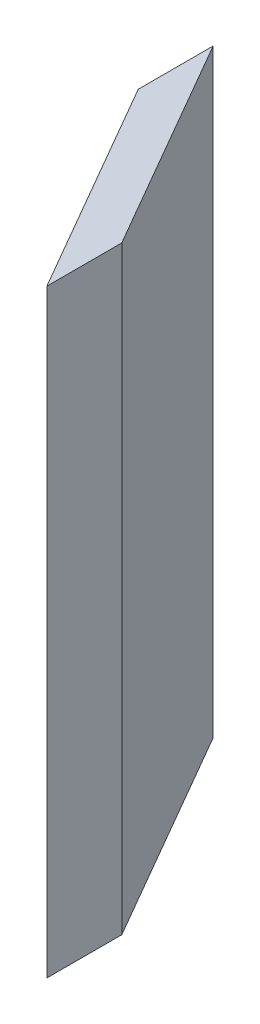
ISO-10303-21;
HEADER;
FILE_DESCRIPTION(('STEP AP214'),'2;1');
FILE_NAME('part.step','',(''),(''),'','','');
FILE_SCHEMA(('AUTOMOTIVE_DESIGN { 1 0 10303 214 1 1 1 1 }'));
ENDSEC;
DATA;
#1=APPLICATION_CONTEXT('core data for automotive mechanical design processes');
#2=APPLICATION_PROTOCOL_DEFINITION('international standard','automotive_design',2000,#1);
#3=PRODUCT_CONTEXT('',#1,'mechanical');
#4=PRODUCT('Part','Part','',(#3));
#5=PRODUCT_RELATED_PRODUCT_CATEGORY('part','',(#4));
#6=PRODUCT_DEFINITION_FORMATION('','',#4);
#7=PRODUCT_DEFINITION_CONTEXT('part definition',#1,'design');
#8=PRODUCT_DEFINITION('design','',#6,#7);
#9=PRODUCT_DEFINITION_SHAPE('','',#8);
#10=(LENGTH_UNIT() NAMED_UNIT(*) SI_UNIT(.MILLI.,.METRE.));
#11=(NAMED_UNIT(*) PLANE_ANGLE_UNIT() SI_UNIT($,.RADIAN.));
#12=(NAMED_UNIT(*) SI_UNIT($,.STERADIAN.) SOLID_ANGLE_UNIT());
#13=UNCERTAINTY_MEASURE_WITH_UNIT(LENGTH_MEASURE(1.E-05),#10,'distance_accuracy_value','');
#14=(GEOMETRIC_REPRESENTATION_CONTEXT(3) GLOBAL_UNCERTAINTY_ASSIGNED_CONTEXT((#13)) GLOBAL_UNIT_ASSIGNED_CONTEXT((#10,
#11,#12)) REPRESENTATION_CONTEXT('',''));
#15=CARTESIAN_POINT('',(0.,0.,0.));
#16=DIRECTION('',(0.,0.,1.));
#17=DIRECTION('',(1.,0.,0.));
#18=AXIS2_PLACEMENT_3D('',#15,#16,#17);
#19=CARTESIAN_POINT('',(25.,120.,43.3012701892219));
#20=DIRECTION('',(-0.866025403784439,0.,0.5));
#21=DIRECTION('',(0.5,0.,0.866025403784439));
#22=AXIS2_PLACEMENT_3D('',#19,#20,#21);
#23=PLANE('',#22);
#24=DIRECTION('',(-0.5,0.,-0.866025403784439));
#25=VECTOR('',#24,1.);
#26=CARTESIAN_POINT('',(25.,0.,43.3012701892219));
#27=LINE('',#26,#25);
#28=CARTESIAN_POINT('',(25.,0.,43.3012701892219));
#29=VERTEX_POINT('',#28);
#30=CARTESIAN_POINT('',(0.,0.,0.));
#31=VERTEX_POINT('',#30);
#32=EDGE_CURVE('E107',#29,#31,#27,.T.);
#33=ORIENTED_EDGE('',*,*,#32,.T.);
#34=DIRECTION('',(0.,-1.,0.));
#35=VECTOR('',#34,1.);
#36=CARTESIAN_POINT('',(0.,120.,0.));
#37=LINE('',#36,#35);
#38=CARTESIAN_POINT('',(0.,120.,0.));
#39=VERTEX_POINT('',#38);
#40=EDGE_CURVE('E11',#39,#31,#37,.T.);
#41=ORIENTED_EDGE('',*,*,#40,.F.);
#42=DIRECTION('',(-0.5,0.,-0.866025403784439));
#43=VECTOR('',#42,1.);
#44=CARTESIAN_POINT('',(25.,120.,43.3012701892219));
#45=LINE('',#44,#43);
#46=CARTESIAN_POINT('',(25.,120.,43.3012701892219));
#47=VERTEX_POINT('',#46);
#48=EDGE_CURVE('E91',#47,#39,#45,.T.);
#49=ORIENTED_EDGE('',*,*,#48,.F.);
#50=DIRECTION('',(0.,-1.,0.));
#51=VECTOR('',#50,1.);
#52=CARTESIAN_POINT('',(25.,120.,43.3012701892219));
#53=LINE('',#52,#51);
#54=EDGE_CURVE('E103',#47,#29,#53,.T.);
#55=ORIENTED_EDGE('',*,*,#54,.T.);
#56=EDGE_LOOP('',(#33,#41,#49,#55));
#57=FACE_BOUND('',#56,.T.);
#58=ADVANCED_FACE('F39',(#57),#23,.F.);
#59=CARTESIAN_POINT('',(0.,120.,0.));
#60=DIRECTION('',(1.,0.,0.));
#61=DIRECTION('',(0.,0.,-1.));
#62=AXIS2_PLACEMENT_3D('',#59,#60,#61);
#63=PLANE('',#62);
#64=DIRECTION('',(0.,0.,1.));
#65=VECTOR('',#64,1.);
#66=CARTESIAN_POINT('',(0.,0.,0.));
#67=LINE('',#66,#65);
#68=CARTESIAN_POINT('',(0.,0.,15.));
#69=VERTEX_POINT('',#68);
#70=EDGE_CURVE('E96',#31,#69,#67,.T.);
#71=ORIENTED_EDGE('',*,*,#70,.T.);
#72=DIRECTION('',(0.,-1.,0.));
#73=VECTOR('',#72,1.);
#74=CARTESIAN_POINT('',(0.,120.,15.));
#75=LINE('',#74,#73);
#76=CARTESIAN_POINT('',(0.,120.,15.));
#77=VERTEX_POINT('',#76);
#78=EDGE_CURVE('E48',#77,#69,#75,.T.);
#79=ORIENTED_EDGE('',*,*,#78,.F.);
#80=DIRECTION('',(0.,0.,1.));
#81=VECTOR('',#80,1.);
#82=CARTESIAN_POINT('',(0.,120.,0.));
#83=LINE('',#82,#81);
#84=EDGE_CURVE('E86',#39,#77,#83,.T.);
#85=ORIENTED_EDGE('',*,*,#84,.F.);
#86=ORIENTED_EDGE('',*,*,#40,.T.);
#87=EDGE_LOOP('',(#71,#79,#85,#86));
#88=FACE_BOUND('',#87,.T.);
#89=ADVANCED_FACE('F95',(#88),#63,.F.);
#90=CARTESIAN_POINT('',(0.,120.,15.));
#91=DIRECTION('',(0.86602540378444,0.,-0.499999999999998));
#92=DIRECTION('',(-0.499999999999998,0.,-0.86602540378444));
#93=AXIS2_PLACEMENT_3D('',#90,#91,#92);
#94=PLANE('',#93);
#95=DIRECTION('',(0.499999999999998,0.,0.86602540378444));
#96=VECTOR('',#95,1.);
#97=CARTESIAN_POINT('',(0.,0.,15.));
#98=LINE('',#97,#96);
#99=CARTESIAN_POINT('',(24.9999999999999,0.,58.301270189222));
#100=VERTEX_POINT('',#99);
#101=EDGE_CURVE('E73',#69,#100,#98,.T.);
#102=ORIENTED_EDGE('',*,*,#101,.T.);
#103=DIRECTION('',(0.,-1.,0.));
#104=VECTOR('',#103,1.);
#105=CARTESIAN_POINT('',(24.9999999999999,120.,58.301270189222));
#106=LINE('',#105,#104);
#107=CARTESIAN_POINT('',(24.9999999999999,120.,58.301270189222));
#108=VERTEX_POINT('',#107);
#109=EDGE_CURVE('E98',#108,#100,#106,.T.);
#110=ORIENTED_EDGE('',*,*,#109,.F.);
#111=DIRECTION('',(0.499999999999998,0.,0.86602540378444));
#112=VECTOR('',#111,1.);
#113=CARTESIAN_POINT('',(0.,120.,15.));
#114=LINE('',#113,#112);
#115=EDGE_CURVE('E89',#77,#108,#114,.T.);
#116=ORIENTED_EDGE('',*,*,#115,.F.);
#117=ORIENTED_EDGE('',*,*,#78,.T.);
#118=EDGE_LOOP('',(#102,#110,#116,#117));
#119=FACE_BOUND('',#118,.T.);
#120=ADVANCED_FACE('F99',(#119),#94,.F.);
#121=CARTESIAN_POINT('',(24.9999999999999,120.,58.301270189222));
#122=DIRECTION('',(-1.,0.,0.));
#123=DIRECTION('',(0.,0.,1.));
#124=AXIS2_PLACEMENT_3D('',#121,#122,#123);
#125=PLANE('',#124);
#126=DIRECTION('',(0.,0.,-1.));
#127=VECTOR('',#126,1.);
#128=CARTESIAN_POINT('',(24.9999999999999,0.,58.301270189222));
#129=LINE('',#128,#127);
#130=EDGE_CURVE('E79',#100,#29,#129,.T.);
#131=ORIENTED_EDGE('',*,*,#130,.T.);
#132=ORIENTED_EDGE('',*,*,#54,.F.);
#133=DIRECTION('',(0.,0.,-1.));
#134=VECTOR('',#133,1.);
#135=CARTESIAN_POINT('',(24.9999999999999,120.,58.301270189222));
#136=LINE('',#135,#134);
#137=EDGE_CURVE('E56',#108,#47,#136,.T.);
#138=ORIENTED_EDGE('',*,*,#137,.F.);
#139=ORIENTED_EDGE('',*,*,#109,.T.);
#140=EDGE_LOOP('',(#131,#132,#138,#139));
#141=FACE_BOUND('',#140,.T.);
#142=ADVANCED_FACE('F120',(#141),#125,.F.);
#143=CARTESIAN_POINT('',(0.,120.,0.));
#144=DIRECTION('',(0.,1.,0.));
#145=DIRECTION('',(0.,0.,1.));
#146=AXIS2_PLACEMENT_3D('',#143,#144,#145);
#147=PLANE('',#146);
#148=ORIENTED_EDGE('',*,*,#48,.T.);
#149=ORIENTED_EDGE('',*,*,#84,.T.);
#150=ORIENTED_EDGE('',*,*,#115,.T.);
#151=ORIENTED_EDGE('',*,*,#137,.T.);
#152=EDGE_LOOP('',(#148,#149,#150,#151));
#153=FACE_BOUND('',#152,.T.);
#154=ADVANCED_FACE('F87',(#153),#147,.T.);
#155=CARTESIAN_POINT('',(0.,0.,0.));
#156=DIRECTION('',(0.,1.,0.));
#157=DIRECTION('',(0.,0.,1.));
#158=AXIS2_PLACEMENT_3D('',#155,#156,#157);
#159=PLANE('',#158);
#160=ORIENTED_EDGE('',*,*,#32,.F.);
#161=ORIENTED_EDGE('',*,*,#130,.F.);
#162=ORIENTED_EDGE('',*,*,#101,.F.);
#163=ORIENTED_EDGE('',*,*,#70,.F.);
#164=EDGE_LOOP('',(#160,#161,#162,#163));
#165=FACE_BOUND('',#164,.T.);
#166=ADVANCED_FACE('F123',(#165),#159,.F.);
#167=CLOSED_SHELL('',(#58,#89,#120,#142,#154,#166));
#168=MANIFOLD_SOLID_BREP('B2',#167);
#169=ADVANCED_BREP_SHAPE_REPRESENTATION('',(#18,#168),#14);
#170=SHAPE_DEFINITION_REPRESENTATION(#9,#169);
ENDSEC;
END-ISO-10303-21;
